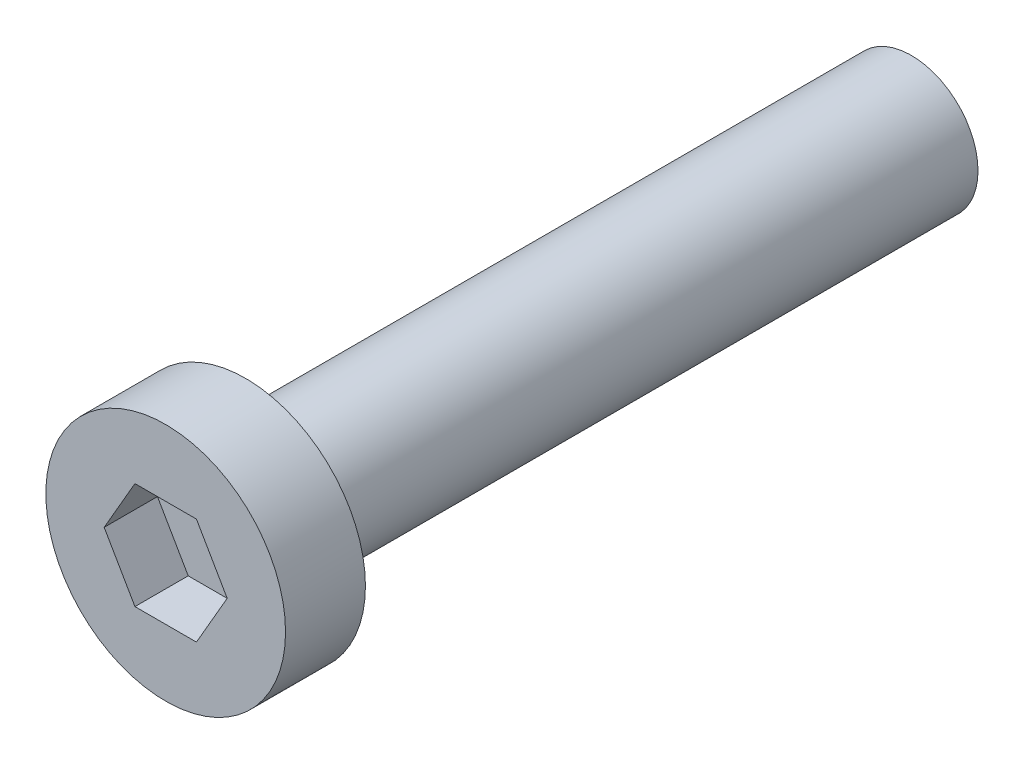
ISO-10303-21;
HEADER;
FILE_DESCRIPTION(('STEP AP214'),'2;1');
FILE_NAME('part.step','',(''),(''),'','','');
FILE_SCHEMA(('AUTOMOTIVE_DESIGN { 1 0 10303 214 1 1 1 1 }'));
ENDSEC;
DATA;
#1=APPLICATION_CONTEXT('core data for automotive mechanical design processes');
#2=APPLICATION_PROTOCOL_DEFINITION('international standard','automotive_design',2000,#1);
#3=PRODUCT_CONTEXT('',#1,'mechanical');
#4=PRODUCT('Part','Part','',(#3));
#5=PRODUCT_RELATED_PRODUCT_CATEGORY('part','',(#4));
#6=PRODUCT_DEFINITION_FORMATION('','',#4);
#7=PRODUCT_DEFINITION_CONTEXT('part definition',#1,'design');
#8=PRODUCT_DEFINITION('design','',#6,#7);
#9=PRODUCT_DEFINITION_SHAPE('','',#8);
#10=(LENGTH_UNIT() NAMED_UNIT(*) SI_UNIT(.MILLI.,.METRE.));
#11=(NAMED_UNIT(*) PLANE_ANGLE_UNIT() SI_UNIT($,.RADIAN.));
#12=(NAMED_UNIT(*) SI_UNIT($,.STERADIAN.) SOLID_ANGLE_UNIT());
#13=UNCERTAINTY_MEASURE_WITH_UNIT(LENGTH_MEASURE(1.E-05),#10,'distance_accuracy_value','');
#14=(GEOMETRIC_REPRESENTATION_CONTEXT(3) GLOBAL_UNCERTAINTY_ASSIGNED_CONTEXT((#13)) GLOBAL_UNIT_ASSIGNED_CONTEXT((#10,
#11,#12)) REPRESENTATION_CONTEXT('',''));
#15=CARTESIAN_POINT('',(0.,0.,0.));
#16=DIRECTION('',(0.,0.,1.));
#17=DIRECTION('',(1.,0.,0.));
#18=AXIS2_PLACEMENT_3D('',#15,#16,#17);
#19=CARTESIAN_POINT('',(0.,0.,50.));
#20=DIRECTION('',(0.,0.,-1.));
#21=DIRECTION('',(-1.,0.,0.));
#22=AXIS2_PLACEMENT_3D('',#19,#20,#21);
#23=CYLINDRICAL_SURFACE('',#22,5.);
#24=CARTESIAN_POINT('',(0.,0.,49.5));
#25=DIRECTION('',(0.,0.,1.));
#26=DIRECTION('',(1.,0.,0.));
#27=AXIS2_PLACEMENT_3D('',#24,#25,#26);
#28=CIRCLE('',#27,5.);
#29=CARTESIAN_POINT('',(5.,0.,49.5));
#30=VERTEX_POINT('',#29);
#31=EDGE_CURVE('E11',#30,#30,#28,.F.);
#32=ORIENTED_EDGE('',*,*,#31,.T.);
#33=EDGE_LOOP('',(#32));
#34=FACE_BOUND('',#33,.T.);
#35=CARTESIAN_POINT('',(0.,0.,0.));
#36=DIRECTION('',(0.,0.,1.));
#37=DIRECTION('',(1.,0.,0.));
#38=AXIS2_PLACEMENT_3D('',#35,#36,#37);
#39=CIRCLE('',#38,5.);
#40=CARTESIAN_POINT('',(5.,0.,0.));
#41=VERTEX_POINT('',#40);
#42=EDGE_CURVE('E181',#41,#41,#39,.T.);
#43=ORIENTED_EDGE('',*,*,#42,.T.);
#44=EDGE_LOOP('',(#43));
#45=FACE_BOUND('',#44,.T.);
#46=ADVANCED_FACE('F51',(#34,#45),#23,.T.);
#47=CARTESIAN_POINT('',(0.,0.,0.));
#48=DIRECTION('',(0.,0.,1.));
#49=DIRECTION('',(1.,0.,0.));
#50=AXIS2_PLACEMENT_3D('',#47,#48,#49);
#51=PLANE('',#50);
#52=ORIENTED_EDGE('',*,*,#42,.F.);
#53=EDGE_LOOP('',(#52));
#54=FACE_BOUND('',#53,.T.);
#55=ADVANCED_FACE('F202',(#54),#51,.F.);
#56=CARTESIAN_POINT('',(0.,0.,56.));
#57=DIRECTION('',(0.,0.,-1.));
#58=DIRECTION('',(-1.,0.,0.));
#59=AXIS2_PLACEMENT_3D('',#56,#57,#58);
#60=CYLINDRICAL_SURFACE('',#59,9.);
#61=CARTESIAN_POINT('',(0.,0.,56.));
#62=DIRECTION('',(0.,0.,1.));
#63=DIRECTION('',(1.,0.,0.));
#64=AXIS2_PLACEMENT_3D('',#61,#62,#63);
#65=CIRCLE('',#64,9.);
#66=CARTESIAN_POINT('',(9.,0.,56.));
#67=VERTEX_POINT('',#66);
#68=EDGE_CURVE('E177',#67,#67,#65,.T.);
#69=ORIENTED_EDGE('',*,*,#68,.F.);
#70=EDGE_LOOP('',(#69));
#71=FACE_BOUND('',#70,.T.);
#72=CARTESIAN_POINT('',(0.,0.,50.));
#73=DIRECTION('',(0.,0.,1.));
#74=DIRECTION('',(1.,0.,0.));
#75=AXIS2_PLACEMENT_3D('',#72,#73,#74);
#76=CIRCLE('',#75,9.);
#77=CARTESIAN_POINT('',(9.,0.,50.));
#78=VERTEX_POINT('',#77);
#79=EDGE_CURVE('E167',#78,#78,#76,.T.);
#80=ORIENTED_EDGE('',*,*,#79,.T.);
#81=EDGE_LOOP('',(#80));
#82=FACE_BOUND('',#81,.T.);
#83=ADVANCED_FACE('F206',(#71,#82),#60,.T.);
#84=CARTESIAN_POINT('',(0.,0.,56.));
#85=DIRECTION('',(0.,0.,1.));
#86=DIRECTION('',(1.,0.,0.));
#87=AXIS2_PLACEMENT_3D('',#84,#85,#86);
#88=PLANE('',#87);
#89=DIRECTION('',(0.5,0.866025403784439,0.));
#90=VECTOR('',#89,1.);
#91=CARTESIAN_POINT('',(2.3094010767585,-4.,56.));
#92=LINE('',#91,#90);
#93=CARTESIAN_POINT('',(2.3094010767585,-4.,56.));
#94=VERTEX_POINT('',#93);
#95=CARTESIAN_POINT('',(4.61880215351701,0.,56.));
#96=VERTEX_POINT('',#95);
#97=EDGE_CURVE('E68',#94,#96,#92,.T.);
#98=ORIENTED_EDGE('',*,*,#97,.F.);
#99=DIRECTION('',(1.,0.,0.));
#100=VECTOR('',#99,1.);
#101=CARTESIAN_POINT('',(-2.30940107675851,-4.,56.));
#102=LINE('',#101,#100);
#103=CARTESIAN_POINT('',(-2.30940107675851,-4.,56.));
#104=VERTEX_POINT('',#103);
#105=EDGE_CURVE('E161',#104,#94,#102,.T.);
#106=ORIENTED_EDGE('',*,*,#105,.F.);
#107=DIRECTION('',(0.499999999999999,-0.866025403784439,0.));
#108=VECTOR('',#107,1.);
#109=CARTESIAN_POINT('',(-4.61880215351701,0.,56.));
#110=LINE('',#109,#108);
#111=CARTESIAN_POINT('',(-4.61880215351701,0.,56.));
#112=VERTEX_POINT('',#111);
#113=EDGE_CURVE('E158',#112,#104,#110,.T.);
#114=ORIENTED_EDGE('',*,*,#113,.F.);
#115=DIRECTION('',(-0.5,-0.866025403784438,0.));
#116=VECTOR('',#115,1.);
#117=CARTESIAN_POINT('',(-2.3094010767585,4.,56.));
#118=LINE('',#117,#116);
#119=CARTESIAN_POINT('',(-2.3094010767585,4.,56.));
#120=VERTEX_POINT('',#119);
#121=EDGE_CURVE('E116',#120,#112,#118,.T.);
#122=ORIENTED_EDGE('',*,*,#121,.F.);
#123=DIRECTION('',(-1.,0.,0.));
#124=VECTOR('',#123,1.);
#125=CARTESIAN_POINT('',(2.3094010767585,4.,56.));
#126=LINE('',#125,#124);
#127=CARTESIAN_POINT('',(2.3094010767585,4.,56.));
#128=VERTEX_POINT('',#127);
#129=EDGE_CURVE('E152',#128,#120,#126,.T.);
#130=ORIENTED_EDGE('',*,*,#129,.F.);
#131=DIRECTION('',(-0.5,0.866025403784439,0.));
#132=VECTOR('',#131,1.);
#133=CARTESIAN_POINT('',(4.61880215351701,0.,56.));
#134=LINE('',#133,#132);
#135=EDGE_CURVE('E148',#96,#128,#134,.T.);
#136=ORIENTED_EDGE('',*,*,#135,.F.);
#137=EDGE_LOOP('',(#98,#106,#114,#122,#130,#136));
#138=FACE_BOUND('',#137,.T.);
#139=ORIENTED_EDGE('',*,*,#68,.T.);
#140=EDGE_LOOP('',(#139));
#141=FACE_BOUND('',#140,.T.);
#142=ADVANCED_FACE('F217',(#138,#141),#88,.T.);
#143=CARTESIAN_POINT('',(0.,0.,50.));
#144=DIRECTION('',(0.,0.,1.));
#145=DIRECTION('',(1.,0.,0.));
#146=AXIS2_PLACEMENT_3D('',#143,#144,#145);
#147=PLANE('',#146);
#148=CARTESIAN_POINT('',(0.,0.,50.));
#149=DIRECTION('',(0.,0.,1.));
#150=DIRECTION('',(1.,0.,0.));
#151=AXIS2_PLACEMENT_3D('',#148,#149,#150);
#152=CIRCLE('',#151,5.5);
#153=CARTESIAN_POINT('',(5.5,0.,50.));
#154=VERTEX_POINT('',#153);
#155=EDGE_CURVE('E61',#154,#154,#152,.T.);
#156=ORIENTED_EDGE('',*,*,#155,.T.);
#157=EDGE_LOOP('',(#156));
#158=FACE_BOUND('',#157,.T.);
#159=ORIENTED_EDGE('',*,*,#79,.F.);
#160=EDGE_LOOP('',(#159));
#161=FACE_BOUND('',#160,.T.);
#162=ADVANCED_FACE('F191',(#158,#161),#147,.F.);
#163=CARTESIAN_POINT('',(2.3094010767585,-4.,52.));
#164=DIRECTION('',(0.866025403784439,-0.5,0.));
#165=DIRECTION('',(0.5,0.866025403784439,0.));
#166=AXIS2_PLACEMENT_3D('',#163,#164,#165);
#167=PLANE('',#166);
#168=ORIENTED_EDGE('',*,*,#97,.T.);
#169=DIRECTION('',(0.,0.,1.));
#170=VECTOR('',#169,1.);
#171=CARTESIAN_POINT('',(4.61880215351701,0.,52.));
#172=LINE('',#171,#170);
#173=CARTESIAN_POINT('',(4.61880215351701,0.,52.));
#174=VERTEX_POINT('',#173);
#175=EDGE_CURVE('E98',#174,#96,#172,.T.);
#176=ORIENTED_EDGE('',*,*,#175,.F.);
#177=DIRECTION('',(0.5,0.866025403784439,0.));
#178=VECTOR('',#177,1.);
#179=CARTESIAN_POINT('',(2.3094010767585,-4.,52.));
#180=LINE('',#179,#178);
#181=CARTESIAN_POINT('',(2.3094010767585,-4.,52.));
#182=VERTEX_POINT('',#181);
#183=EDGE_CURVE('E164',#182,#174,#180,.T.);
#184=ORIENTED_EDGE('',*,*,#183,.F.);
#185=DIRECTION('',(0.,0.,1.));
#186=VECTOR('',#185,1.);
#187=CARTESIAN_POINT('',(2.3094010767585,-4.,52.));
#188=LINE('',#187,#186);
#189=EDGE_CURVE('E76',#182,#94,#188,.T.);
#190=ORIENTED_EDGE('',*,*,#189,.T.);
#191=EDGE_LOOP('',(#168,#176,#184,#190));
#192=FACE_BOUND('',#191,.T.);
#193=ADVANCED_FACE('F223',(#192),#167,.F.);
#194=CARTESIAN_POINT('',(-2.30940107675851,-4.,52.));
#195=DIRECTION('',(0.,-1.,0.));
#196=DIRECTION('',(0.,0.,-1.));
#197=AXIS2_PLACEMENT_3D('',#194,#195,#196);
#198=PLANE('',#197);
#199=ORIENTED_EDGE('',*,*,#105,.T.);
#200=ORIENTED_EDGE('',*,*,#189,.F.);
#201=DIRECTION('',(1.,0.,0.));
#202=VECTOR('',#201,1.);
#203=CARTESIAN_POINT('',(-2.30940107675851,-4.,52.));
#204=LINE('',#203,#202);
#205=CARTESIAN_POINT('',(-2.30940107675851,-4.,52.));
#206=VERTEX_POINT('',#205);
#207=EDGE_CURVE('E130',#206,#182,#204,.T.);
#208=ORIENTED_EDGE('',*,*,#207,.F.);
#209=DIRECTION('',(0.,0.,1.));
#210=VECTOR('',#209,1.);
#211=CARTESIAN_POINT('',(-2.30940107675851,-4.,52.));
#212=LINE('',#211,#210);
#213=EDGE_CURVE('E121',#206,#104,#212,.T.);
#214=ORIENTED_EDGE('',*,*,#213,.T.);
#215=EDGE_LOOP('',(#199,#200,#208,#214));
#216=FACE_BOUND('',#215,.T.);
#217=ADVANCED_FACE('F230',(#216),#198,.F.);
#218=CARTESIAN_POINT('',(-4.61880215351701,0.,52.));
#219=DIRECTION('',(-0.866025403784439,-0.499999999999999,0.));
#220=DIRECTION('',(0.5,-0.866025403784439,0.));
#221=AXIS2_PLACEMENT_3D('',#218,#219,#220);
#222=PLANE('',#221);
#223=ORIENTED_EDGE('',*,*,#113,.T.);
#224=ORIENTED_EDGE('',*,*,#213,.F.);
#225=DIRECTION('',(0.499999999999999,-0.866025403784439,0.));
#226=VECTOR('',#225,1.);
#227=CARTESIAN_POINT('',(-4.61880215351701,0.,52.));
#228=LINE('',#227,#226);
#229=CARTESIAN_POINT('',(-4.61880215351701,0.,52.));
#230=VERTEX_POINT('',#229);
#231=EDGE_CURVE('E125',#230,#206,#228,.T.);
#232=ORIENTED_EDGE('',*,*,#231,.F.);
#233=DIRECTION('',(0.,0.,1.));
#234=VECTOR('',#233,1.);
#235=CARTESIAN_POINT('',(-4.61880215351701,0.,52.));
#236=LINE('',#235,#234);
#237=EDGE_CURVE('E109',#230,#112,#236,.T.);
#238=ORIENTED_EDGE('',*,*,#237,.T.);
#239=EDGE_LOOP('',(#223,#224,#232,#238));
#240=FACE_BOUND('',#239,.T.);
#241=ADVANCED_FACE('F126',(#240),#222,.F.);
#242=CARTESIAN_POINT('',(-2.3094010767585,4.,52.));
#243=DIRECTION('',(-0.866025403784439,0.5,0.));
#244=DIRECTION('',(-0.5,-0.866025403784438,0.));
#245=AXIS2_PLACEMENT_3D('',#242,#243,#244);
#246=PLANE('',#245);
#247=ORIENTED_EDGE('',*,*,#121,.T.);
#248=ORIENTED_EDGE('',*,*,#237,.F.);
#249=DIRECTION('',(-0.5,-0.866025403784438,0.));
#250=VECTOR('',#249,1.);
#251=CARTESIAN_POINT('',(-2.3094010767585,4.,52.));
#252=LINE('',#251,#250);
#253=CARTESIAN_POINT('',(-2.3094010767585,4.,52.));
#254=VERTEX_POINT('',#253);
#255=EDGE_CURVE('E113',#254,#230,#252,.T.);
#256=ORIENTED_EDGE('',*,*,#255,.F.);
#257=DIRECTION('',(0.,0.,1.));
#258=VECTOR('',#257,1.);
#259=CARTESIAN_POINT('',(-2.3094010767585,4.,52.));
#260=LINE('',#259,#258);
#261=EDGE_CURVE('E122',#254,#120,#260,.T.);
#262=ORIENTED_EDGE('',*,*,#261,.T.);
#263=EDGE_LOOP('',(#247,#248,#256,#262));
#264=FACE_BOUND('',#263,.T.);
#265=ADVANCED_FACE('F111',(#264),#246,.F.);
#266=CARTESIAN_POINT('',(2.3094010767585,4.,52.));
#267=DIRECTION('',(0.,1.,0.));
#268=DIRECTION('',(-1.,0.,0.));
#269=AXIS2_PLACEMENT_3D('',#266,#267,#268);
#270=PLANE('',#269);
#271=ORIENTED_EDGE('',*,*,#129,.T.);
#272=ORIENTED_EDGE('',*,*,#261,.F.);
#273=DIRECTION('',(-1.,0.,0.));
#274=VECTOR('',#273,1.);
#275=CARTESIAN_POINT('',(2.3094010767585,4.,52.));
#276=LINE('',#275,#274);
#277=CARTESIAN_POINT('',(2.3094010767585,4.,52.));
#278=VERTEX_POINT('',#277);
#279=EDGE_CURVE('E136',#278,#254,#276,.T.);
#280=ORIENTED_EDGE('',*,*,#279,.F.);
#281=DIRECTION('',(0.,0.,1.));
#282=VECTOR('',#281,1.);
#283=CARTESIAN_POINT('',(2.3094010767585,4.,52.));
#284=LINE('',#283,#282);
#285=EDGE_CURVE('E172',#278,#128,#284,.T.);
#286=ORIENTED_EDGE('',*,*,#285,.T.);
#287=EDGE_LOOP('',(#271,#272,#280,#286));
#288=FACE_BOUND('',#287,.T.);
#289=ADVANCED_FACE('F236',(#288),#270,.F.);
#290=CARTESIAN_POINT('',(4.61880215351701,0.,52.));
#291=DIRECTION('',(0.866025403784439,0.5,0.));
#292=DIRECTION('',(-0.5,0.866025403784439,0.));
#293=AXIS2_PLACEMENT_3D('',#290,#291,#292);
#294=PLANE('',#293);
#295=ORIENTED_EDGE('',*,*,#135,.T.);
#296=ORIENTED_EDGE('',*,*,#285,.F.);
#297=DIRECTION('',(-0.5,0.866025403784439,0.));
#298=VECTOR('',#297,1.);
#299=CARTESIAN_POINT('',(4.61880215351701,0.,52.));
#300=LINE('',#299,#298);
#301=EDGE_CURVE('E142',#174,#278,#300,.T.);
#302=ORIENTED_EDGE('',*,*,#301,.F.);
#303=ORIENTED_EDGE('',*,*,#175,.T.);
#304=EDGE_LOOP('',(#295,#296,#302,#303));
#305=FACE_BOUND('',#304,.T.);
#306=ADVANCED_FACE('F198',(#305),#294,.F.);
#307=CARTESIAN_POINT('',(0.,0.,52.));
#308=DIRECTION('',(0.,0.,1.));
#309=DIRECTION('',(1.,0.,0.));
#310=AXIS2_PLACEMENT_3D('',#307,#308,#309);
#311=PLANE('',#310);
#312=ORIENTED_EDGE('',*,*,#183,.T.);
#313=ORIENTED_EDGE('',*,*,#301,.T.);
#314=ORIENTED_EDGE('',*,*,#279,.T.);
#315=ORIENTED_EDGE('',*,*,#255,.T.);
#316=ORIENTED_EDGE('',*,*,#231,.T.);
#317=ORIENTED_EDGE('',*,*,#207,.T.);
#318=EDGE_LOOP('',(#312,#313,#314,#315,#316,#317));
#319=FACE_BOUND('',#318,.T.);
#320=ADVANCED_FACE('F133',(#319),#311,.T.);
#321=CARTESIAN_POINT('',(0.,0.,49.5));
#322=DIRECTION('',(0.,0.,1.));
#323=DIRECTION('',(1.,0.,0.));
#324=AXIS2_PLACEMENT_3D('',#321,#322,#323);
#325=TOROIDAL_SURFACE('',#324,5.5,0.5);
#326=ORIENTED_EDGE('',*,*,#31,.F.);
#327=EDGE_LOOP('',(#326));
#328=FACE_BOUND('',#327,.T.);
#329=ORIENTED_EDGE('',*,*,#155,.F.);
#330=EDGE_LOOP('',(#329));
#331=FACE_BOUND('',#330,.T.);
#332=ADVANCED_FACE('F54',(#328,#331),#325,.F.);
#333=CLOSED_SHELL('',(#46,#55,#83,#142,#162,#193,#217,#241,#265,#289,#306,#320,#332));
#334=MANIFOLD_SOLID_BREP('B2',#333);
#335=ADVANCED_BREP_SHAPE_REPRESENTATION('',(#18,#334),#14);
#336=SHAPE_DEFINITION_REPRESENTATION(#9,#335);
ENDSEC;
END-ISO-10303-21;
